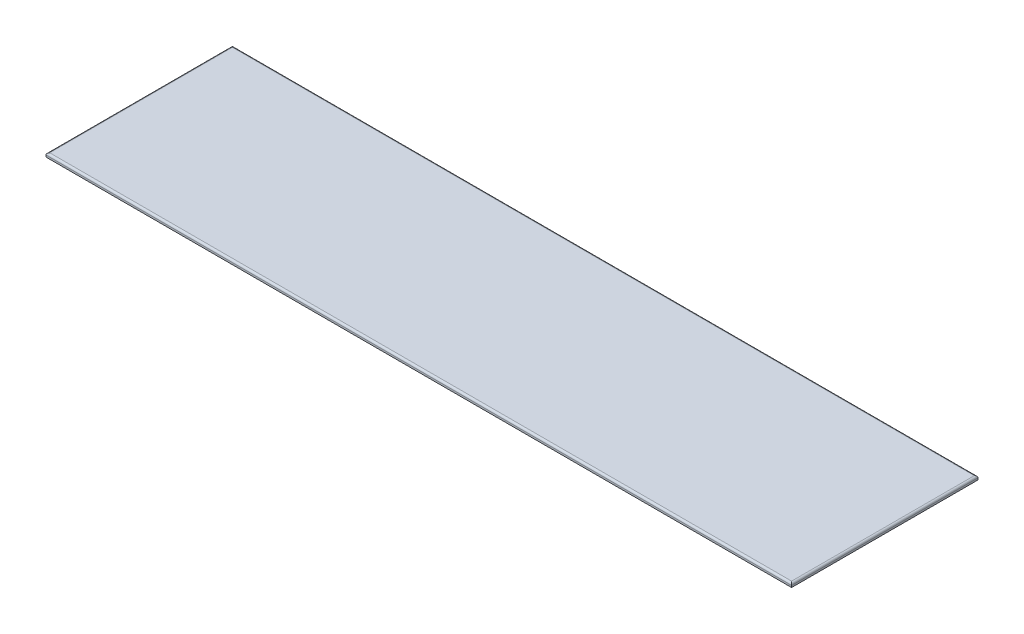
ISO-10303-21;
HEADER;
FILE_DESCRIPTION(('STEP AP214'),'2;1');
FILE_NAME('part.step','',(''),(''),'','','');
FILE_SCHEMA(('AUTOMOTIVE_DESIGN { 1 0 10303 214 1 1 1 1 }'));
ENDSEC;
DATA;
#1=APPLICATION_CONTEXT('core data for automotive mechanical design processes');
#2=APPLICATION_PROTOCOL_DEFINITION('international standard','automotive_design',2000,#1);
#3=PRODUCT_CONTEXT('',#1,'mechanical');
#4=PRODUCT('Part','Part','',(#3));
#5=PRODUCT_RELATED_PRODUCT_CATEGORY('part','',(#4));
#6=PRODUCT_DEFINITION_FORMATION('','',#4);
#7=PRODUCT_DEFINITION_CONTEXT('part definition',#1,'design');
#8=PRODUCT_DEFINITION('design','',#6,#7);
#9=PRODUCT_DEFINITION_SHAPE('','',#8);
#10=(LENGTH_UNIT() NAMED_UNIT(*) SI_UNIT(.MILLI.,.METRE.));
#11=(NAMED_UNIT(*) PLANE_ANGLE_UNIT() SI_UNIT($,.RADIAN.));
#12=(NAMED_UNIT(*) SI_UNIT($,.STERADIAN.) SOLID_ANGLE_UNIT());
#13=UNCERTAINTY_MEASURE_WITH_UNIT(LENGTH_MEASURE(1.E-05),#10,'distance_accuracy_value','');
#14=(GEOMETRIC_REPRESENTATION_CONTEXT(3) GLOBAL_UNCERTAINTY_ASSIGNED_CONTEXT((#13)) GLOBAL_UNIT_ASSIGNED_CONTEXT((#10,
#11,#12)) REPRESENTATION_CONTEXT('',''));
#15=CARTESIAN_POINT('',(0.,0.,0.));
#16=DIRECTION('',(0.,0.,1.));
#17=DIRECTION('',(1.,0.,0.));
#18=AXIS2_PLACEMENT_3D('',#15,#16,#17);
#19=CARTESIAN_POINT('',(0.,-1.,0.));
#20=DIRECTION('',(-1.,0.,0.));
#21=DIRECTION('',(0.,0.,1.));
#22=AXIS2_PLACEMENT_3D('',#19,#20,#21);
#23=PLANE('',#22);
#24=DIRECTION('',(0.,1.,0.));
#25=VECTOR('',#24,1.);
#26=CARTESIAN_POINT('',(0.,-1.,0.));
#27=LINE('',#26,#25);
#28=CARTESIAN_POINT('',(0.,-1.,0.));
#29=VERTEX_POINT('',#28);
#30=CARTESIAN_POINT('',(0.,-0.5,0.));
#31=VERTEX_POINT('',#30);
#32=EDGE_CURVE('E100',#29,#31,#27,.T.);
#33=ORIENTED_EDGE('',*,*,#32,.T.);
#34=DIRECTION('',(0.,0.,1.));
#35=VECTOR('',#34,1.);
#36=CARTESIAN_POINT('',(0.,-0.5,-50.));
#37=LINE('',#36,#35);
#38=CARTESIAN_POINT('',(0.,-0.5,-50.));
#39=VERTEX_POINT('',#38);
#40=EDGE_CURVE('E58',#31,#39,#37,.F.);
#41=ORIENTED_EDGE('',*,*,#40,.T.);
#42=DIRECTION('',(0.,1.,0.));
#43=VECTOR('',#42,1.);
#44=CARTESIAN_POINT('',(0.,-1.,-50.));
#45=LINE('',#44,#43);
#46=CARTESIAN_POINT('',(0.,-1.,-50.));
#47=VERTEX_POINT('',#46);
#48=EDGE_CURVE('E120',#47,#39,#45,.T.);
#49=ORIENTED_EDGE('',*,*,#48,.F.);
#50=DIRECTION('',(0.,0.,1.));
#51=VECTOR('',#50,1.);
#52=CARTESIAN_POINT('',(0.,-1.,0.));
#53=LINE('',#52,#51);
#54=EDGE_CURVE('E114',#47,#29,#53,.T.);
#55=ORIENTED_EDGE('',*,*,#54,.T.);
#56=EDGE_LOOP('',(#33,#41,#49,#55));
#57=FACE_BOUND('',#56,.T.);
#58=ADVANCED_FACE('F48',(#57),#23,.T.);
#59=CARTESIAN_POINT('',(0.,-1.,-50.));
#60=DIRECTION('',(0.,0.,-1.));
#61=DIRECTION('',(-1.,0.,0.));
#62=AXIS2_PLACEMENT_3D('',#59,#60,#61);
#63=PLANE('',#62);
#64=ORIENTED_EDGE('',*,*,#48,.T.);
#65=DIRECTION('',(-1.,0.,0.));
#66=VECTOR('',#65,1.);
#67=CARTESIAN_POINT('',(200.,-0.5,-50.));
#68=LINE('',#67,#66);
#69=CARTESIAN_POINT('',(200.,-0.5,-50.));
#70=VERTEX_POINT('',#69);
#71=EDGE_CURVE('E156',#39,#70,#68,.F.);
#72=ORIENTED_EDGE('',*,*,#71,.T.);
#73=DIRECTION('',(0.,1.,0.));
#74=VECTOR('',#73,1.);
#75=CARTESIAN_POINT('',(200.,-1.,-50.));
#76=LINE('',#75,#74);
#77=CARTESIAN_POINT('',(200.,-1.,-50.));
#78=VERTEX_POINT('',#77);
#79=EDGE_CURVE('E134',#78,#70,#76,.T.);
#80=ORIENTED_EDGE('',*,*,#79,.F.);
#81=DIRECTION('',(-1.,0.,0.));
#82=VECTOR('',#81,1.);
#83=CARTESIAN_POINT('',(0.,-1.,-50.));
#84=LINE('',#83,#82);
#85=EDGE_CURVE('E107',#78,#47,#84,.T.);
#86=ORIENTED_EDGE('',*,*,#85,.T.);
#87=EDGE_LOOP('',(#64,#72,#80,#86));
#88=FACE_BOUND('',#87,.T.);
#89=ADVANCED_FACE('F188',(#88),#63,.T.);
#90=CARTESIAN_POINT('',(200.,-1.,0.));
#91=DIRECTION('',(1.,0.,0.));
#92=DIRECTION('',(0.,0.,-1.));
#93=AXIS2_PLACEMENT_3D('',#90,#91,#92);
#94=PLANE('',#93);
#95=ORIENTED_EDGE('',*,*,#79,.T.);
#96=DIRECTION('',(0.,0.,-1.));
#97=VECTOR('',#96,1.);
#98=CARTESIAN_POINT('',(200.,-0.5,0.));
#99=LINE('',#98,#97);
#100=CARTESIAN_POINT('',(200.,-0.5,0.));
#101=VERTEX_POINT('',#100);
#102=EDGE_CURVE('E152',#70,#101,#99,.F.);
#103=ORIENTED_EDGE('',*,*,#102,.T.);
#104=DIRECTION('',(0.,1.,0.));
#105=VECTOR('',#104,1.);
#106=CARTESIAN_POINT('',(200.,-1.,0.));
#107=LINE('',#106,#105);
#108=CARTESIAN_POINT('',(200.,-1.,0.));
#109=VERTEX_POINT('',#108);
#110=EDGE_CURVE('E106',#109,#101,#107,.T.);
#111=ORIENTED_EDGE('',*,*,#110,.F.);
#112=DIRECTION('',(0.,0.,-1.));
#113=VECTOR('',#112,1.);
#114=CARTESIAN_POINT('',(200.,-1.,0.));
#115=LINE('',#114,#113);
#116=EDGE_CURVE('E117',#109,#78,#115,.T.);
#117=ORIENTED_EDGE('',*,*,#116,.T.);
#118=EDGE_LOOP('',(#95,#103,#111,#117));
#119=FACE_BOUND('',#118,.T.);
#120=ADVANCED_FACE('F186',(#119),#94,.T.);
#121=CARTESIAN_POINT('',(0.,-1.,0.));
#122=DIRECTION('',(0.,0.,1.));
#123=DIRECTION('',(1.,0.,0.));
#124=AXIS2_PLACEMENT_3D('',#121,#122,#123);
#125=PLANE('',#124);
#126=ORIENTED_EDGE('',*,*,#110,.T.);
#127=DIRECTION('',(1.,0.,0.));
#128=VECTOR('',#127,1.);
#129=CARTESIAN_POINT('',(0.,-0.5,0.));
#130=LINE('',#129,#128);
#131=EDGE_CURVE('E11',#101,#31,#130,.F.);
#132=ORIENTED_EDGE('',*,*,#131,.T.);
#133=ORIENTED_EDGE('',*,*,#32,.F.);
#134=DIRECTION('',(1.,0.,0.));
#135=VECTOR('',#134,1.);
#136=CARTESIAN_POINT('',(0.,-1.,0.));
#137=LINE('',#136,#135);
#138=EDGE_CURVE('E103',#29,#109,#137,.T.);
#139=ORIENTED_EDGE('',*,*,#138,.T.);
#140=EDGE_LOOP('',(#126,#132,#133,#139));
#141=FACE_BOUND('',#140,.T.);
#142=ADVANCED_FACE('F102',(#141),#125,.T.);
#143=CARTESIAN_POINT('',(0.,-1.,0.));
#144=DIRECTION('',(0.,-1.,0.));
#145=DIRECTION('',(0.,0.,-1.));
#146=AXIS2_PLACEMENT_3D('',#143,#144,#145);
#147=PLANE('',#146);
#148=ORIENTED_EDGE('',*,*,#54,.F.);
#149=ORIENTED_EDGE('',*,*,#85,.F.);
#150=ORIENTED_EDGE('',*,*,#116,.F.);
#151=ORIENTED_EDGE('',*,*,#138,.F.);
#152=EDGE_LOOP('',(#148,#149,#150,#151));
#153=FACE_BOUND('',#152,.T.);
#154=ADVANCED_FACE('F112',(#153),#147,.T.);
#155=CARTESIAN_POINT('',(0.,0.,0.));
#156=DIRECTION('',(0.,-1.,0.));
#157=DIRECTION('',(0.,0.,-1.));
#158=AXIS2_PLACEMENT_3D('',#155,#156,#157);
#159=PLANE('',#158);
#160=DIRECTION('',(1.,0.,0.));
#161=VECTOR('',#160,1.);
#162=CARTESIAN_POINT('',(200.,0.,-0.5));
#163=LINE('',#162,#161);
#164=CARTESIAN_POINT('',(0.5,0.,-0.5));
#165=VERTEX_POINT('',#164);
#166=CARTESIAN_POINT('',(199.5,0.,-0.5));
#167=VERTEX_POINT('',#166);
#168=EDGE_CURVE('E133',#165,#167,#163,.T.);
#169=ORIENTED_EDGE('',*,*,#168,.T.);
#170=DIRECTION('',(0.,0.,-1.));
#171=VECTOR('',#170,1.);
#172=CARTESIAN_POINT('',(199.5,0.,-50.));
#173=LINE('',#172,#171);
#174=CARTESIAN_POINT('',(199.5,0.,-49.5));
#175=VERTEX_POINT('',#174);
#176=EDGE_CURVE('E148',#167,#175,#173,.T.);
#177=ORIENTED_EDGE('',*,*,#176,.T.);
#178=DIRECTION('',(-1.,0.,0.));
#179=VECTOR('',#178,1.);
#180=CARTESIAN_POINT('',(0.,0.,-49.5));
#181=LINE('',#180,#179);
#182=CARTESIAN_POINT('',(0.5,0.,-49.5));
#183=VERTEX_POINT('',#182);
#184=EDGE_CURVE('E145',#175,#183,#181,.T.);
#185=ORIENTED_EDGE('',*,*,#184,.T.);
#186=DIRECTION('',(0.,0.,1.));
#187=VECTOR('',#186,1.);
#188=CARTESIAN_POINT('',(0.5,0.,0.));
#189=LINE('',#188,#187);
#190=EDGE_CURVE('E142',#183,#165,#189,.T.);
#191=ORIENTED_EDGE('',*,*,#190,.T.);
#192=EDGE_LOOP('',(#169,#177,#185,#191));
#193=FACE_BOUND('',#192,.T.);
#194=ADVANCED_FACE('F179',(#193),#159,.F.);
#195=CARTESIAN_POINT('',(0.5,-0.5,0.));
#196=DIRECTION('',(0.,0.,-1.));
#197=DIRECTION('',(-1.,0.,0.));
#198=AXIS2_PLACEMENT_3D('',#195,#196,#197);
#199=CYLINDRICAL_SURFACE('',#198,0.5);
#200=CARTESIAN_POINT('',(0.5,-0.5,-49.5));
#201=DIRECTION('',(0.707106781186547,0.,-0.707106781186547));
#202=DIRECTION('',(-0.707106781186547,0.,-0.707106781186547));
#203=AXIS2_PLACEMENT_3D('',#200,#201,#202);
#204=ELLIPSE('',#203,0.707106781186547,0.5);
#205=EDGE_CURVE('E125',#39,#183,#204,.T.);
#206=ORIENTED_EDGE('',*,*,#205,.F.);
#207=ORIENTED_EDGE('',*,*,#40,.F.);
#208=CARTESIAN_POINT('',(0.5,-0.5,-0.5));
#209=DIRECTION('',(-0.707106781186547,0.,-0.707106781186547));
#210=DIRECTION('',(-0.707106781186547,0.,0.707106781186547));
#211=AXIS2_PLACEMENT_3D('',#208,#209,#210);
#212=ELLIPSE('',#211,0.707106781186547,0.5);
#213=EDGE_CURVE('E52',#165,#31,#212,.F.);
#214=ORIENTED_EDGE('',*,*,#213,.F.);
#215=ORIENTED_EDGE('',*,*,#190,.F.);
#216=EDGE_LOOP('',(#206,#207,#214,#215));
#217=FACE_BOUND('',#216,.T.);
#218=ADVANCED_FACE('F50',(#217),#199,.T.);
#219=CARTESIAN_POINT('',(0.,-0.5,-0.5));
#220=DIRECTION('',(-1.,0.,0.));
#221=DIRECTION('',(0.,0.,1.));
#222=AXIS2_PLACEMENT_3D('',#219,#220,#221);
#223=CYLINDRICAL_SURFACE('',#222,0.5);
#224=ORIENTED_EDGE('',*,*,#213,.T.);
#225=ORIENTED_EDGE('',*,*,#131,.F.);
#226=CARTESIAN_POINT('',(199.5,-0.5,-0.5));
#227=DIRECTION('',(-0.707106781186547,0.,0.707106781186547));
#228=DIRECTION('',(-0.707106781186547,0.,-0.707106781186547));
#229=AXIS2_PLACEMENT_3D('',#226,#227,#228);
#230=ELLIPSE('',#229,0.707106781186547,0.5);
#231=EDGE_CURVE('E164',#167,#101,#230,.F.);
#232=ORIENTED_EDGE('',*,*,#231,.F.);
#233=ORIENTED_EDGE('',*,*,#168,.F.);
#234=EDGE_LOOP('',(#224,#225,#232,#233));
#235=FACE_BOUND('',#234,.T.);
#236=ADVANCED_FACE('F205',(#235),#223,.T.);
#237=CARTESIAN_POINT('',(0.,-0.5,-49.5));
#238=DIRECTION('',(1.,0.,0.));
#239=DIRECTION('',(0.,0.,-1.));
#240=AXIS2_PLACEMENT_3D('',#237,#238,#239);
#241=CYLINDRICAL_SURFACE('',#240,0.5);
#242=ORIENTED_EDGE('',*,*,#205,.T.);
#243=ORIENTED_EDGE('',*,*,#184,.F.);
#244=CARTESIAN_POINT('',(199.5,-0.5,-49.5));
#245=DIRECTION('',(0.707106781186547,0.,0.707106781186547));
#246=DIRECTION('',(0.707106781186547,0.,-0.707106781186547));
#247=AXIS2_PLACEMENT_3D('',#244,#245,#246);
#248=ELLIPSE('',#247,0.707106781186547,0.5);
#249=EDGE_CURVE('E161',#70,#175,#248,.T.);
#250=ORIENTED_EDGE('',*,*,#249,.F.);
#251=ORIENTED_EDGE('',*,*,#71,.F.);
#252=EDGE_LOOP('',(#242,#243,#250,#251));
#253=FACE_BOUND('',#252,.T.);
#254=ADVANCED_FACE('F172',(#253),#241,.T.);
#255=CARTESIAN_POINT('',(199.5,-0.5,0.));
#256=DIRECTION('',(0.,0.,1.));
#257=DIRECTION('',(1.,0.,0.));
#258=AXIS2_PLACEMENT_3D('',#255,#256,#257);
#259=CYLINDRICAL_SURFACE('',#258,0.5);
#260=ORIENTED_EDGE('',*,*,#231,.T.);
#261=ORIENTED_EDGE('',*,*,#102,.F.);
#262=ORIENTED_EDGE('',*,*,#249,.T.);
#263=ORIENTED_EDGE('',*,*,#176,.F.);
#264=EDGE_LOOP('',(#260,#261,#262,#263));
#265=FACE_BOUND('',#264,.T.);
#266=ADVANCED_FACE('F183',(#265),#259,.T.);
#267=CLOSED_SHELL('',(#58,#89,#120,#142,#154,#194,#218,#236,#254,#266));
#268=MANIFOLD_SOLID_BREP('B2',#267);
#269=ADVANCED_BREP_SHAPE_REPRESENTATION('',(#18,#268),#14);
#270=SHAPE_DEFINITION_REPRESENTATION(#9,#269);
ENDSEC;
END-ISO-10303-21;
